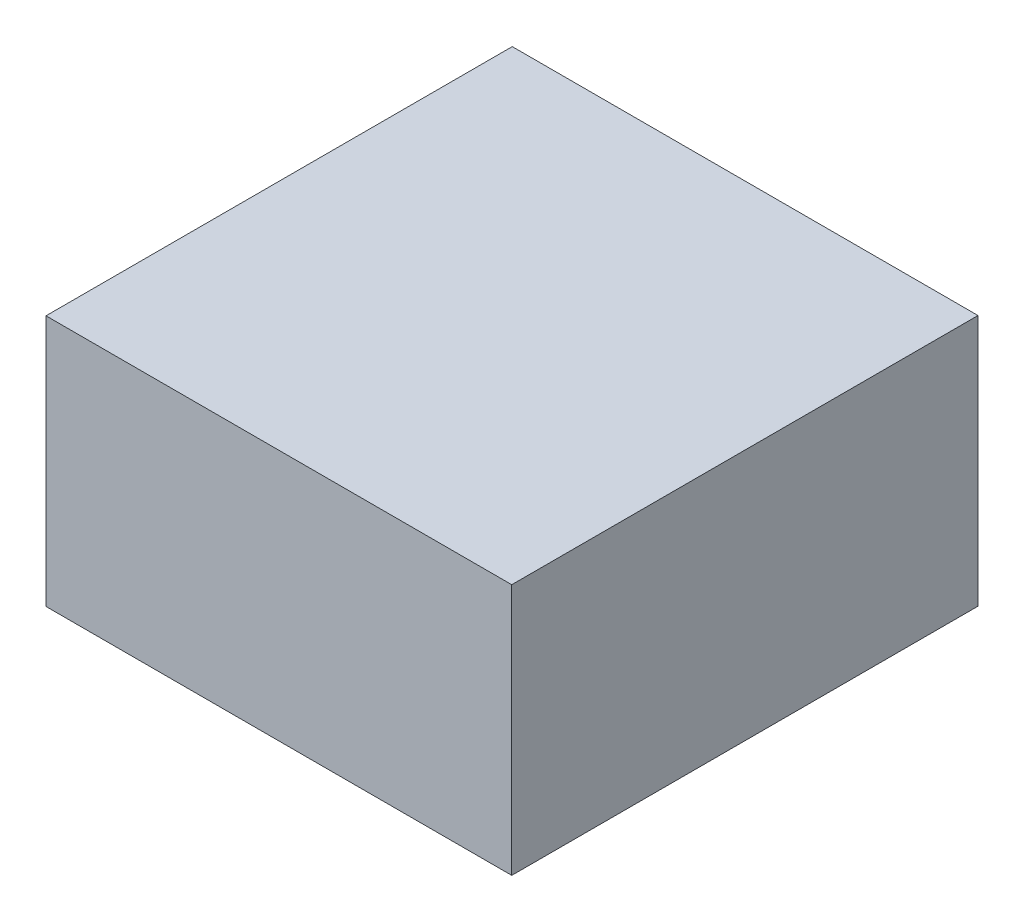
ISO-10303-21;
HEADER;
FILE_DESCRIPTION(('STEP AP214'),'2;1');
FILE_NAME('part.step','',(''),(''),'','','');
FILE_SCHEMA(('AUTOMOTIVE_DESIGN { 1 0 10303 214 1 1 1 1 }'));
ENDSEC;
DATA;
#1=APPLICATION_CONTEXT('core data for automotive mechanical design processes');
#2=APPLICATION_PROTOCOL_DEFINITION('international standard','automotive_design',2000,#1);
#3=PRODUCT_CONTEXT('',#1,'mechanical');
#4=PRODUCT('Part','Part','',(#3));
#5=PRODUCT_RELATED_PRODUCT_CATEGORY('part','',(#4));
#6=PRODUCT_DEFINITION_FORMATION('','',#4);
#7=PRODUCT_DEFINITION_CONTEXT('part definition',#1,'design');
#8=PRODUCT_DEFINITION('design','',#6,#7);
#9=PRODUCT_DEFINITION_SHAPE('','',#8);
#10=(LENGTH_UNIT() NAMED_UNIT(*) SI_UNIT(.MILLI.,.METRE.));
#11=(NAMED_UNIT(*) PLANE_ANGLE_UNIT() SI_UNIT($,.RADIAN.));
#12=(NAMED_UNIT(*) SI_UNIT($,.STERADIAN.) SOLID_ANGLE_UNIT());
#13=UNCERTAINTY_MEASURE_WITH_UNIT(LENGTH_MEASURE(1.E-05),#10,'distance_accuracy_value','');
#14=(GEOMETRIC_REPRESENTATION_CONTEXT(3) GLOBAL_UNCERTAINTY_ASSIGNED_CONTEXT((#13)) GLOBAL_UNIT_ASSIGNED_CONTEXT((#10,
#11,#12)) REPRESENTATION_CONTEXT('',''));
#15=CARTESIAN_POINT('',(0.,0.,0.));
#16=DIRECTION('',(0.,0.,1.));
#17=DIRECTION('',(1.,0.,0.));
#18=AXIS2_PLACEMENT_3D('',#15,#16,#17);
#19=CARTESIAN_POINT('',(0.,63.5,0.));
#20=DIRECTION('',(1.,0.,0.));
#21=DIRECTION('',(0.,0.,-1.));
#22=AXIS2_PLACEMENT_3D('',#19,#20,#21);
#23=PLANE('',#22);
#24=DIRECTION('',(0.,0.,1.));
#25=VECTOR('',#24,1.);
#26=CARTESIAN_POINT('',(0.,0.,0.));
#27=LINE('',#26,#25);
#28=CARTESIAN_POINT('',(0.,0.,-117.602));
#29=VERTEX_POINT('',#28);
#30=CARTESIAN_POINT('',(0.,0.,0.));
#31=VERTEX_POINT('',#30);
#32=EDGE_CURVE('E94',#29,#31,#27,.T.);
#33=ORIENTED_EDGE('',*,*,#32,.T.);
#34=DIRECTION('',(0.,-1.,0.));
#35=VECTOR('',#34,1.);
#36=CARTESIAN_POINT('',(0.,63.5,0.));
#37=LINE('',#36,#35);
#38=CARTESIAN_POINT('',(0.,63.5,0.));
#39=VERTEX_POINT('',#38);
#40=EDGE_CURVE('E11',#39,#31,#37,.T.);
#41=ORIENTED_EDGE('',*,*,#40,.F.);
#42=DIRECTION('',(0.,0.,1.));
#43=VECTOR('',#42,1.);
#44=CARTESIAN_POINT('',(0.,63.5,0.));
#45=LINE('',#44,#43);
#46=CARTESIAN_POINT('',(0.,63.5,-117.602));
#47=VERTEX_POINT('',#46);
#48=EDGE_CURVE('E88',#47,#39,#45,.T.);
#49=ORIENTED_EDGE('',*,*,#48,.F.);
#50=DIRECTION('',(0.,-1.,0.));
#51=VECTOR('',#50,1.);
#52=CARTESIAN_POINT('',(0.,63.5,-117.602));
#53=LINE('',#52,#51);
#54=EDGE_CURVE('E50',#47,#29,#53,.T.);
#55=ORIENTED_EDGE('',*,*,#54,.T.);
#56=EDGE_LOOP('',(#33,#41,#49,#55));
#57=FACE_BOUND('',#56,.T.);
#58=ADVANCED_FACE('F43',(#57),#23,.F.);
#59=CARTESIAN_POINT('',(0.,63.5,0.));
#60=DIRECTION('',(0.,0.,-1.));
#61=DIRECTION('',(-1.,0.,0.));
#62=AXIS2_PLACEMENT_3D('',#59,#60,#61);
#63=PLANE('',#62);
#64=DIRECTION('',(1.,0.,0.));
#65=VECTOR('',#64,1.);
#66=CARTESIAN_POINT('',(0.,0.,0.));
#67=LINE('',#66,#65);
#68=CARTESIAN_POINT('',(117.475,0.,0.));
#69=VERTEX_POINT('',#68);
#70=EDGE_CURVE('E89',#31,#69,#67,.T.);
#71=ORIENTED_EDGE('',*,*,#70,.T.);
#72=DIRECTION('',(0.,1.,0.));
#73=VECTOR('',#72,1.);
#74=CARTESIAN_POINT('',(117.475,0.,0.));
#75=LINE('',#74,#73);
#76=CARTESIAN_POINT('',(117.475,63.5,0.));
#77=VERTEX_POINT('',#76);
#78=EDGE_CURVE('E57',#69,#77,#75,.T.);
#79=ORIENTED_EDGE('',*,*,#78,.T.);
#80=DIRECTION('',(1.,0.,0.));
#81=VECTOR('',#80,1.);
#82=CARTESIAN_POINT('',(0.,63.5,0.));
#83=LINE('',#82,#81);
#84=EDGE_CURVE('E102',#39,#77,#83,.T.);
#85=ORIENTED_EDGE('',*,*,#84,.F.);
#86=ORIENTED_EDGE('',*,*,#40,.T.);
#87=EDGE_LOOP('',(#71,#79,#85,#86));
#88=FACE_BOUND('',#87,.T.);
#89=ADVANCED_FACE('F111',(#88),#63,.F.);
#90=CARTESIAN_POINT('',(0.,63.5,-117.602));
#91=DIRECTION('',(0.,0.,1.));
#92=DIRECTION('',(1.,0.,0.));
#93=AXIS2_PLACEMENT_3D('',#90,#91,#92);
#94=PLANE('',#93);
#95=DIRECTION('',(-1.,0.,0.));
#96=VECTOR('',#95,1.);
#97=CARTESIAN_POINT('',(0.,63.5,-117.602));
#98=LINE('',#97,#96);
#99=CARTESIAN_POINT('',(117.475,63.5,-117.602));
#100=VERTEX_POINT('',#99);
#101=EDGE_CURVE('E66',#100,#47,#98,.T.);
#102=ORIENTED_EDGE('',*,*,#101,.F.);
#103=DIRECTION('',(0.,1.,0.));
#104=VECTOR('',#103,1.);
#105=CARTESIAN_POINT('',(117.475,0.,-117.602));
#106=LINE('',#105,#104);
#107=CARTESIAN_POINT('',(117.475,0.,-117.602));
#108=VERTEX_POINT('',#107);
#109=EDGE_CURVE('E85',#108,#100,#106,.T.);
#110=ORIENTED_EDGE('',*,*,#109,.F.);
#111=DIRECTION('',(-1.,0.,0.));
#112=VECTOR('',#111,1.);
#113=CARTESIAN_POINT('',(0.,0.,-117.602));
#114=LINE('',#113,#112);
#115=EDGE_CURVE('E80',#108,#29,#114,.T.);
#116=ORIENTED_EDGE('',*,*,#115,.T.);
#117=ORIENTED_EDGE('',*,*,#54,.F.);
#118=EDGE_LOOP('',(#102,#110,#116,#117));
#119=FACE_BOUND('',#118,.T.);
#120=ADVANCED_FACE('F82',(#119),#94,.F.);
#121=CARTESIAN_POINT('',(0.,63.5,0.));
#122=DIRECTION('',(0.,-1.,0.));
#123=DIRECTION('',(0.,0.,-1.));
#124=AXIS2_PLACEMENT_3D('',#121,#122,#123);
#125=PLANE('',#124);
#126=ORIENTED_EDGE('',*,*,#84,.T.);
#127=DIRECTION('',(0.,0.,1.));
#128=VECTOR('',#127,1.);
#129=CARTESIAN_POINT('',(117.475,63.5,-117.602));
#130=LINE('',#129,#128);
#131=EDGE_CURVE('E108',#100,#77,#130,.T.);
#132=ORIENTED_EDGE('',*,*,#131,.F.);
#133=ORIENTED_EDGE('',*,*,#101,.T.);
#134=ORIENTED_EDGE('',*,*,#48,.T.);
#135=EDGE_LOOP('',(#126,#132,#133,#134));
#136=FACE_BOUND('',#135,.T.);
#137=ADVANCED_FACE('F113',(#136),#125,.F.);
#138=CARTESIAN_POINT('',(0.,0.,0.));
#139=DIRECTION('',(0.,-1.,0.));
#140=DIRECTION('',(0.,0.,-1.));
#141=AXIS2_PLACEMENT_3D('',#138,#139,#140);
#142=PLANE('',#141);
#143=DIRECTION('',(0.,0.,1.));
#144=VECTOR('',#143,1.);
#145=CARTESIAN_POINT('',(117.475,0.,-117.602));
#146=LINE('',#145,#144);
#147=EDGE_CURVE('E106',#108,#69,#146,.T.);
#148=ORIENTED_EDGE('',*,*,#147,.T.);
#149=ORIENTED_EDGE('',*,*,#70,.F.);
#150=ORIENTED_EDGE('',*,*,#32,.F.);
#151=ORIENTED_EDGE('',*,*,#115,.F.);
#152=EDGE_LOOP('',(#148,#149,#150,#151));
#153=FACE_BOUND('',#152,.T.);
#154=ADVANCED_FACE('F95',(#153),#142,.T.);
#155=CARTESIAN_POINT('',(117.475,0.,-117.602));
#156=DIRECTION('',(-1.,0.,0.));
#157=DIRECTION('',(0.,0.,1.));
#158=AXIS2_PLACEMENT_3D('',#155,#156,#157);
#159=PLANE('',#158);
#160=ORIENTED_EDGE('',*,*,#131,.T.);
#161=ORIENTED_EDGE('',*,*,#78,.F.);
#162=ORIENTED_EDGE('',*,*,#147,.F.);
#163=ORIENTED_EDGE('',*,*,#109,.T.);
#164=EDGE_LOOP('',(#160,#161,#162,#163));
#165=FACE_BOUND('',#164,.T.);
#166=ADVANCED_FACE('F120',(#165),#159,.F.);
#167=CLOSED_SHELL('',(#58,#89,#120,#137,#154,#166));
#168=MANIFOLD_SOLID_BREP('B2',#167);
#169=ADVANCED_BREP_SHAPE_REPRESENTATION('',(#18,#168),#14);
#170=SHAPE_DEFINITION_REPRESENTATION(#9,#169);
ENDSEC;
END-ISO-10303-21;
